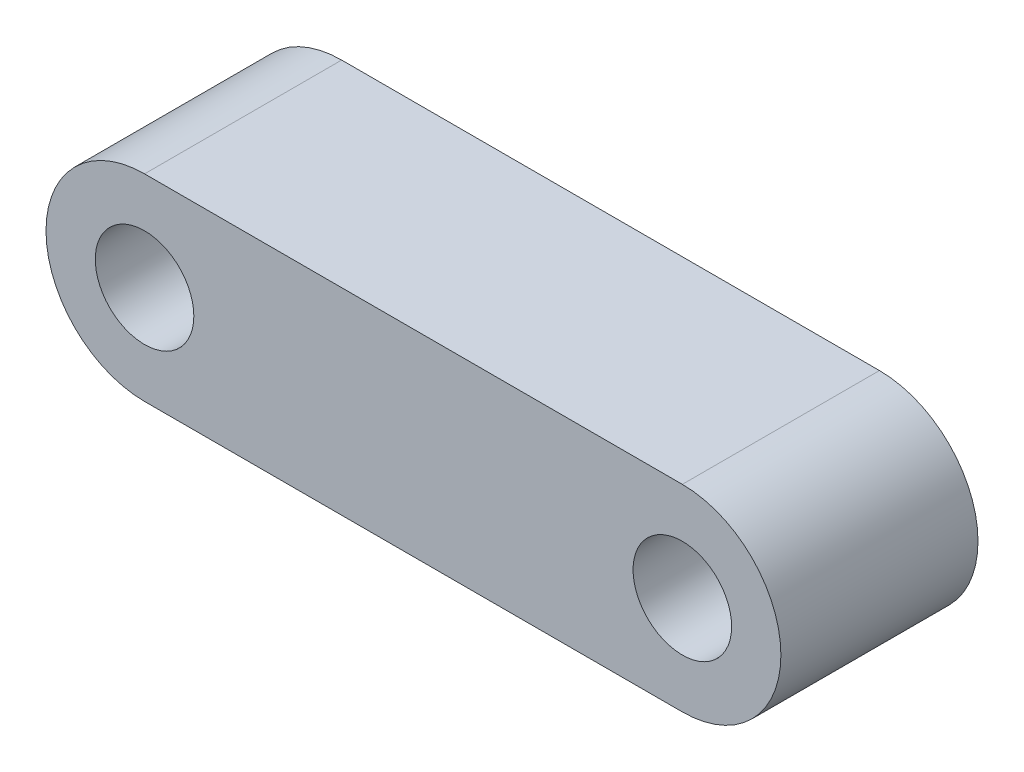
ISO-10303-21;
HEADER;
FILE_DESCRIPTION(('STEP AP214'),'2;1');
FILE_NAME('part.step','',(''),(''),'','','');
FILE_SCHEMA(('AUTOMOTIVE_DESIGN { 1 0 10303 214 1 1 1 1 }'));
ENDSEC;
DATA;
#1=APPLICATION_CONTEXT('core data for automotive mechanical design processes');
#2=APPLICATION_PROTOCOL_DEFINITION('international standard','automotive_design',2000,#1);
#3=PRODUCT_CONTEXT('',#1,'mechanical');
#4=PRODUCT('Part','Part','',(#3));
#5=PRODUCT_RELATED_PRODUCT_CATEGORY('part','',(#4));
#6=PRODUCT_DEFINITION_FORMATION('','',#4);
#7=PRODUCT_DEFINITION_CONTEXT('part definition',#1,'design');
#8=PRODUCT_DEFINITION('design','',#6,#7);
#9=PRODUCT_DEFINITION_SHAPE('','',#8);
#10=(LENGTH_UNIT() NAMED_UNIT(*) SI_UNIT(.MILLI.,.METRE.));
#11=(NAMED_UNIT(*) PLANE_ANGLE_UNIT() SI_UNIT($,.RADIAN.));
#12=(NAMED_UNIT(*) SI_UNIT($,.STERADIAN.) SOLID_ANGLE_UNIT());
#13=UNCERTAINTY_MEASURE_WITH_UNIT(LENGTH_MEASURE(1.E-05),#10,'distance_accuracy_value','');
#14=(GEOMETRIC_REPRESENTATION_CONTEXT(3) GLOBAL_UNCERTAINTY_ASSIGNED_CONTEXT((#13)) GLOBAL_UNIT_ASSIGNED_CONTEXT((#10,
#11,#12)) REPRESENTATION_CONTEXT('',''));
#15=CARTESIAN_POINT('',(0.,0.,0.));
#16=DIRECTION('',(0.,0.,1.));
#17=DIRECTION('',(1.,0.,0.));
#18=AXIS2_PLACEMENT_3D('',#15,#16,#17);
#19=CARTESIAN_POINT('',(0.,0.,-3.));
#20=DIRECTION('',(0.,0.,1.));
#21=DIRECTION('',(1.,0.,0.));
#22=AXIS2_PLACEMENT_3D('',#19,#20,#21);
#23=CYLINDRICAL_SURFACE('',#22,3.);
#24=DIRECTION('',(0.,0.,1.));
#25=VECTOR('',#24,1.);
#26=CARTESIAN_POINT('',(0.,-3.,-3.));
#27=LINE('',#26,#25);
#28=CARTESIAN_POINT('',(0.,-3.,-3.));
#29=VERTEX_POINT('',#28);
#30=CARTESIAN_POINT('',(0.,-3.,3.));
#31=VERTEX_POINT('',#30);
#32=EDGE_CURVE('E36',#29,#31,#27,.T.);
#33=ORIENTED_EDGE('',*,*,#32,.T.);
#34=CARTESIAN_POINT('',(0.,0.,3.));
#35=DIRECTION('',(0.,0.,1.));
#36=DIRECTION('',(1.,0.,0.));
#37=AXIS2_PLACEMENT_3D('',#34,#35,#36);
#38=CIRCLE('',#37,3.);
#39=CARTESIAN_POINT('',(0.,3.,3.));
#40=VERTEX_POINT('',#39);
#41=EDGE_CURVE('E73',#40,#31,#38,.T.);
#42=ORIENTED_EDGE('',*,*,#41,.F.);
#43=DIRECTION('',(0.,0.,1.));
#44=VECTOR('',#43,1.);
#45=CARTESIAN_POINT('',(0.,3.,-3.));
#46=LINE('',#45,#44);
#47=CARTESIAN_POINT('',(0.,3.,-3.));
#48=VERTEX_POINT('',#47);
#49=EDGE_CURVE('E11',#48,#40,#46,.T.);
#50=ORIENTED_EDGE('',*,*,#49,.F.);
#51=CARTESIAN_POINT('',(0.,0.,-3.));
#52=DIRECTION('',(0.,0.,1.));
#53=DIRECTION('',(1.,0.,0.));
#54=AXIS2_PLACEMENT_3D('',#51,#52,#53);
#55=CIRCLE('',#54,3.);
#56=EDGE_CURVE('E74',#48,#29,#55,.T.);
#57=ORIENTED_EDGE('',*,*,#56,.T.);
#58=EDGE_LOOP('',(#33,#42,#50,#57));
#59=FACE_BOUND('',#58,.T.);
#60=ADVANCED_FACE('F33',(#59),#23,.T.);
#61=CARTESIAN_POINT('',(0.,3.,-3.));
#62=DIRECTION('',(0.,1.,0.));
#63=DIRECTION('',(-1.,0.,0.));
#64=AXIS2_PLACEMENT_3D('',#61,#62,#63);
#65=PLANE('',#64);
#66=ORIENTED_EDGE('',*,*,#49,.T.);
#67=DIRECTION('',(-1.,0.,0.));
#68=VECTOR('',#67,1.);
#69=CARTESIAN_POINT('',(0.,3.,3.));
#70=LINE('',#69,#68);
#71=CARTESIAN_POINT('',(16.37,3.,3.));
#72=VERTEX_POINT('',#71);
#73=EDGE_CURVE('E91',#72,#40,#70,.T.);
#74=ORIENTED_EDGE('',*,*,#73,.F.);
#75=DIRECTION('',(0.,0.,1.));
#76=VECTOR('',#75,1.);
#77=CARTESIAN_POINT('',(16.37,3.,-3.));
#78=LINE('',#77,#76);
#79=CARTESIAN_POINT('',(16.37,3.,-3.));
#80=VERTEX_POINT('',#79);
#81=EDGE_CURVE('E41',#80,#72,#78,.T.);
#82=ORIENTED_EDGE('',*,*,#81,.F.);
#83=DIRECTION('',(-1.,0.,0.));
#84=VECTOR('',#83,1.);
#85=CARTESIAN_POINT('',(0.,3.,-3.));
#86=LINE('',#85,#84);
#87=EDGE_CURVE('E79',#80,#48,#86,.T.);
#88=ORIENTED_EDGE('',*,*,#87,.T.);
#89=EDGE_LOOP('',(#66,#74,#82,#88));
#90=FACE_BOUND('',#89,.T.);
#91=ADVANCED_FACE('F117',(#90),#65,.T.);
#92=CARTESIAN_POINT('',(16.37,0.,-3.));
#93=DIRECTION('',(0.,0.,1.));
#94=DIRECTION('',(1.,0.,0.));
#95=AXIS2_PLACEMENT_3D('',#92,#93,#94);
#96=CYLINDRICAL_SURFACE('',#95,3.);
#97=ORIENTED_EDGE('',*,*,#81,.T.);
#98=CARTESIAN_POINT('',(16.37,0.,3.));
#99=DIRECTION('',(0.,0.,1.));
#100=DIRECTION('',(1.,0.,0.));
#101=AXIS2_PLACEMENT_3D('',#98,#99,#100);
#102=CIRCLE('',#101,3.);
#103=CARTESIAN_POINT('',(16.37,-3.,3.));
#104=VERTEX_POINT('',#103);
#105=EDGE_CURVE('E86',#104,#72,#102,.T.);
#106=ORIENTED_EDGE('',*,*,#105,.F.);
#107=DIRECTION('',(0.,0.,1.));
#108=VECTOR('',#107,1.);
#109=CARTESIAN_POINT('',(16.37,-3.,-3.));
#110=LINE('',#109,#108);
#111=CARTESIAN_POINT('',(16.37,-3.,-3.));
#112=VERTEX_POINT('',#111);
#113=EDGE_CURVE('E78',#112,#104,#110,.T.);
#114=ORIENTED_EDGE('',*,*,#113,.F.);
#115=CARTESIAN_POINT('',(16.37,0.,-3.));
#116=DIRECTION('',(0.,0.,1.));
#117=DIRECTION('',(1.,0.,0.));
#118=AXIS2_PLACEMENT_3D('',#115,#116,#117);
#119=CIRCLE('',#118,3.);
#120=EDGE_CURVE('E110',#112,#80,#119,.T.);
#121=ORIENTED_EDGE('',*,*,#120,.T.);
#122=EDGE_LOOP('',(#97,#106,#114,#121));
#123=FACE_BOUND('',#122,.T.);
#124=ADVANCED_FACE('F114',(#123),#96,.T.);
#125=CARTESIAN_POINT('',(0.,-3.,-3.));
#126=DIRECTION('',(0.,-1.,0.));
#127=DIRECTION('',(1.,0.,0.));
#128=AXIS2_PLACEMENT_3D('',#125,#126,#127);
#129=PLANE('',#128);
#130=ORIENTED_EDGE('',*,*,#113,.T.);
#131=DIRECTION('',(1.,0.,0.));
#132=VECTOR('',#131,1.);
#133=CARTESIAN_POINT('',(0.,-3.,3.));
#134=LINE('',#133,#132);
#135=EDGE_CURVE('E81',#31,#104,#134,.T.);
#136=ORIENTED_EDGE('',*,*,#135,.F.);
#137=ORIENTED_EDGE('',*,*,#32,.F.);
#138=DIRECTION('',(1.,0.,0.));
#139=VECTOR('',#138,1.);
#140=CARTESIAN_POINT('',(0.,-3.,-3.));
#141=LINE('',#140,#139);
#142=EDGE_CURVE('E108',#29,#112,#141,.T.);
#143=ORIENTED_EDGE('',*,*,#142,.T.);
#144=EDGE_LOOP('',(#130,#136,#137,#143));
#145=FACE_BOUND('',#144,.T.);
#146=ADVANCED_FACE('F82',(#145),#129,.T.);
#147=CARTESIAN_POINT('',(0.,0.,-3.));
#148=DIRECTION('',(0.,0.,1.));
#149=DIRECTION('',(1.,0.,0.));
#150=AXIS2_PLACEMENT_3D('',#147,#148,#149);
#151=PLANE('',#150);
#152=CARTESIAN_POINT('',(16.37,0.,-3.));
#153=DIRECTION('',(0.,0.,1.));
#154=DIRECTION('',(1.,0.,0.));
#155=AXIS2_PLACEMENT_3D('',#152,#153,#154);
#156=CIRCLE('',#155,1.5);
#157=CARTESIAN_POINT('',(17.87,0.,-3.));
#158=VERTEX_POINT('',#157);
#159=EDGE_CURVE('E101',#158,#158,#156,.T.);
#160=ORIENTED_EDGE('',*,*,#159,.T.);
#161=EDGE_LOOP('',(#160));
#162=FACE_BOUND('',#161,.T.);
#163=CARTESIAN_POINT('',(0.,0.,-3.));
#164=DIRECTION('',(0.,0.,1.));
#165=DIRECTION('',(1.,0.,0.));
#166=AXIS2_PLACEMENT_3D('',#163,#164,#165);
#167=CIRCLE('',#166,1.5);
#168=CARTESIAN_POINT('',(1.5,0.,-3.));
#169=VERTEX_POINT('',#168);
#170=EDGE_CURVE('E104',#169,#169,#167,.T.);
#171=ORIENTED_EDGE('',*,*,#170,.T.);
#172=EDGE_LOOP('',(#171));
#173=FACE_BOUND('',#172,.T.);
#174=ORIENTED_EDGE('',*,*,#56,.F.);
#175=ORIENTED_EDGE('',*,*,#87,.F.);
#176=ORIENTED_EDGE('',*,*,#120,.F.);
#177=ORIENTED_EDGE('',*,*,#142,.F.);
#178=EDGE_LOOP('',(#174,#175,#176,#177));
#179=FACE_BOUND('',#178,.T.);
#180=ADVANCED_FACE('F119',(#162,#173,#179),#151,.F.);
#181=CARTESIAN_POINT('',(0.,0.,-3.));
#182=DIRECTION('',(0.,0.,1.));
#183=DIRECTION('',(1.,0.,0.));
#184=AXIS2_PLACEMENT_3D('',#181,#182,#183);
#185=CYLINDRICAL_SURFACE('',#184,1.5);
#186=ORIENTED_EDGE('',*,*,#170,.F.);
#187=EDGE_LOOP('',(#186));
#188=FACE_BOUND('',#187,.T.);
#189=CARTESIAN_POINT('',(0.,0.,3.));
#190=DIRECTION('',(0.,0.,1.));
#191=DIRECTION('',(1.,0.,0.));
#192=AXIS2_PLACEMENT_3D('',#189,#190,#191);
#193=CIRCLE('',#192,1.5);
#194=CARTESIAN_POINT('',(1.5,0.,3.));
#195=VERTEX_POINT('',#194);
#196=EDGE_CURVE('E92',#195,#195,#193,.T.);
#197=ORIENTED_EDGE('',*,*,#196,.T.);
#198=EDGE_LOOP('',(#197));
#199=FACE_BOUND('',#198,.T.);
#200=ADVANCED_FACE('F121',(#188,#199),#185,.F.);
#201=CARTESIAN_POINT('',(16.37,0.,-3.));
#202=DIRECTION('',(0.,0.,1.));
#203=DIRECTION('',(1.,0.,0.));
#204=AXIS2_PLACEMENT_3D('',#201,#202,#203);
#205=CYLINDRICAL_SURFACE('',#204,1.5);
#206=ORIENTED_EDGE('',*,*,#159,.F.);
#207=EDGE_LOOP('',(#206));
#208=FACE_BOUND('',#207,.T.);
#209=CARTESIAN_POINT('',(16.37,0.,3.));
#210=DIRECTION('',(0.,0.,1.));
#211=DIRECTION('',(1.,0.,0.));
#212=AXIS2_PLACEMENT_3D('',#209,#210,#211);
#213=CIRCLE('',#212,1.5);
#214=CARTESIAN_POINT('',(17.87,0.,3.));
#215=VERTEX_POINT('',#214);
#216=EDGE_CURVE('E95',#215,#215,#213,.T.);
#217=ORIENTED_EDGE('',*,*,#216,.T.);
#218=EDGE_LOOP('',(#217));
#219=FACE_BOUND('',#218,.T.);
#220=ADVANCED_FACE('F128',(#208,#219),#205,.F.);
#221=CARTESIAN_POINT('',(0.,0.,3.));
#222=DIRECTION('',(0.,0.,1.));
#223=DIRECTION('',(1.,0.,0.));
#224=AXIS2_PLACEMENT_3D('',#221,#222,#223);
#225=PLANE('',#224);
#226=ORIENTED_EDGE('',*,*,#196,.F.);
#227=EDGE_LOOP('',(#226));
#228=FACE_BOUND('',#227,.T.);
#229=ORIENTED_EDGE('',*,*,#41,.T.);
#230=ORIENTED_EDGE('',*,*,#135,.T.);
#231=ORIENTED_EDGE('',*,*,#105,.T.);
#232=ORIENTED_EDGE('',*,*,#73,.T.);
#233=EDGE_LOOP('',(#229,#230,#231,#232));
#234=FACE_BOUND('',#233,.T.);
#235=ORIENTED_EDGE('',*,*,#216,.F.);
#236=EDGE_LOOP('',(#235));
#237=FACE_BOUND('',#236,.T.);
#238=ADVANCED_FACE('F89',(#228,#234,#237),#225,.T.);
#239=CLOSED_SHELL('',(#60,#91,#124,#146,#180,#200,#220,#238));
#240=MANIFOLD_SOLID_BREP('B2',#239);
#241=ADVANCED_BREP_SHAPE_REPRESENTATION('',(#18,#240),#14);
#242=SHAPE_DEFINITION_REPRESENTATION(#9,#241);
ENDSEC;
END-ISO-10303-21;
